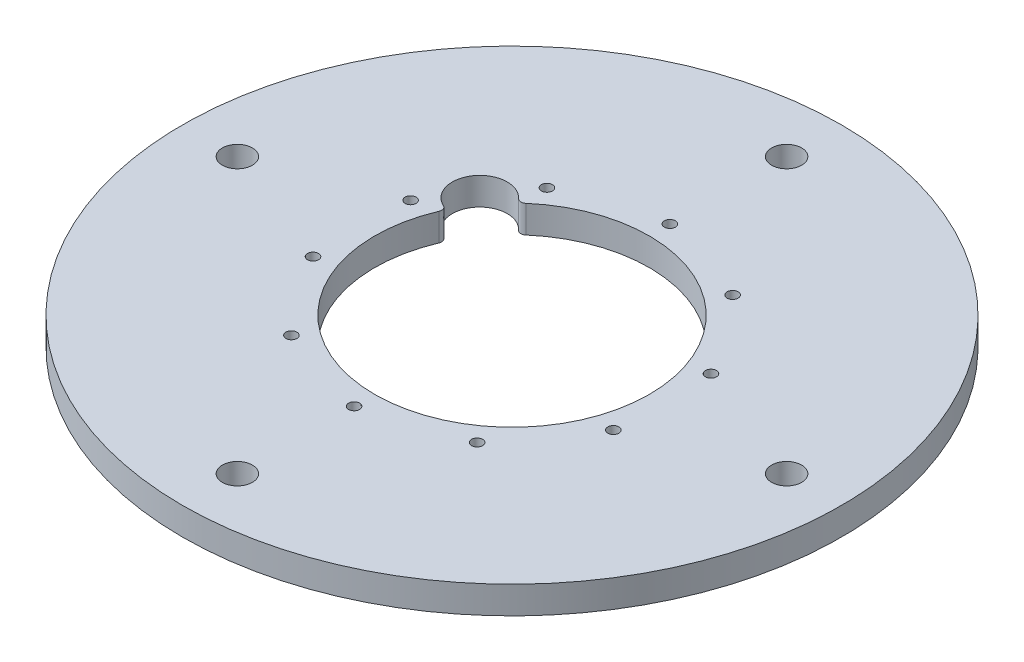
ISO-10303-21;
HEADER;
FILE_DESCRIPTION(('STEP AP214'),'2;1');
FILE_NAME('part.step','',(''),(''),'','','');
FILE_SCHEMA(('AUTOMOTIVE_DESIGN { 1 0 10303 214 1 1 1 1 }'));
ENDSEC;
DATA;
#1=APPLICATION_CONTEXT('core data for automotive mechanical design processes');
#2=APPLICATION_PROTOCOL_DEFINITION('international standard','automotive_design',2000,#1);
#3=PRODUCT_CONTEXT('',#1,'mechanical');
#4=PRODUCT('Part','Part','',(#3));
#5=PRODUCT_RELATED_PRODUCT_CATEGORY('part','',(#4));
#6=PRODUCT_DEFINITION_FORMATION('','',#4);
#7=PRODUCT_DEFINITION_CONTEXT('part definition',#1,'design');
#8=PRODUCT_DEFINITION('design','',#6,#7);
#9=PRODUCT_DEFINITION_SHAPE('','',#8);
#10=(LENGTH_UNIT() NAMED_UNIT(*) SI_UNIT(.MILLI.,.METRE.));
#11=(NAMED_UNIT(*) PLANE_ANGLE_UNIT() SI_UNIT($,.RADIAN.));
#12=(NAMED_UNIT(*) SI_UNIT($,.STERADIAN.) SOLID_ANGLE_UNIT());
#13=UNCERTAINTY_MEASURE_WITH_UNIT(LENGTH_MEASURE(1.E-05),#10,'distance_accuracy_value','');
#14=(GEOMETRIC_REPRESENTATION_CONTEXT(3) GLOBAL_UNCERTAINTY_ASSIGNED_CONTEXT((#13)) GLOBAL_UNIT_ASSIGNED_CONTEXT((#10,
#11,#12)) REPRESENTATION_CONTEXT('',''));
#15=CARTESIAN_POINT('',(0.,0.,0.));
#16=DIRECTION('',(0.,0.,1.));
#17=DIRECTION('',(1.,0.,0.));
#18=AXIS2_PLACEMENT_3D('',#15,#16,#17);
#19=CARTESIAN_POINT('',(0.,-12.7,0.));
#20=DIRECTION('',(0.,1.,0.));
#21=DIRECTION('',(0.,0.,1.));
#22=AXIS2_PLACEMENT_3D('',#19,#20,#21);
#23=CYLINDRICAL_SURFACE('',#22,63.5);
#24=DIRECTION('',(0.,1.,0.));
#25=VECTOR('',#24,1.);
#26=CARTESIAN_POINT('',(-41.5931280540035,-12.701,-47.9818892779689));
#27=LINE('',#26,#25);
#28=CARTESIAN_POINT('',(-41.5931280540035,-12.7,-47.9818892779689));
#29=VERTEX_POINT('',#28);
#30=CARTESIAN_POINT('',(-41.5931280540035,0.,-47.9818892779689));
#31=VERTEX_POINT('',#30);
#32=EDGE_CURVE('E97',#29,#31,#27,.T.);
#33=ORIENTED_EDGE('',*,*,#32,.F.);
#34=CARTESIAN_POINT('',(0.,-12.7,0.));
#35=DIRECTION('',(0.,1.,0.));
#36=DIRECTION('',(0.,0.,1.));
#37=AXIS2_PLACEMENT_3D('',#34,#35,#36);
#38=CIRCLE('',#37,63.5);
#39=CARTESIAN_POINT('',(-58.4864718798655,-12.7,-24.730196259749));
#40=VERTEX_POINT('',#39);
#41=EDGE_CURVE('E51',#40,#29,#38,.T.);
#42=ORIENTED_EDGE('',*,*,#41,.F.);
#43=DIRECTION('',(0.,1.,0.));
#44=VECTOR('',#43,1.);
#45=CARTESIAN_POINT('',(-58.4864718798655,-12.701,-24.730196259749));
#46=LINE('',#45,#44);
#47=CARTESIAN_POINT('',(-58.4864718798655,0.,-24.730196259749));
#48=VERTEX_POINT('',#47);
#49=EDGE_CURVE('E112',#40,#48,#46,.T.);
#50=ORIENTED_EDGE('',*,*,#49,.T.);
#51=CARTESIAN_POINT('',(0.,0.,0.));
#52=DIRECTION('',(0.,1.,0.));
#53=DIRECTION('',(0.,0.,1.));
#54=AXIS2_PLACEMENT_3D('',#51,#52,#53);
#55=CIRCLE('',#54,63.5);
#56=EDGE_CURVE('E199',#48,#31,#55,.T.);
#57=ORIENTED_EDGE('',*,*,#56,.T.);
#58=EDGE_LOOP('',(#33,#42,#50,#57));
#59=FACE_BOUND('',#58,.T.);
#60=ADVANCED_FACE('F43',(#59),#23,.F.);
#61=CARTESIAN_POINT('',(0.,-12.7,0.));
#62=DIRECTION('',(0.,1.,0.));
#63=DIRECTION('',(0.,0.,1.));
#64=AXIS2_PLACEMENT_3D('',#61,#62,#63);
#65=CYLINDRICAL_SURFACE('',#64,152.4);
#66=CARTESIAN_POINT('',(0.,-12.7,0.));
#67=DIRECTION('',(0.,1.,0.));
#68=DIRECTION('',(0.,0.,1.));
#69=AXIS2_PLACEMENT_3D('',#66,#67,#68);
#70=CIRCLE('',#69,152.4);
#71=CARTESIAN_POINT('',(0.,-12.7,152.4));
#72=VERTEX_POINT('',#71);
#73=EDGE_CURVE('E11',#72,#72,#70,.T.);
#74=ORIENTED_EDGE('',*,*,#73,.T.);
#75=EDGE_LOOP('',(#74));
#76=FACE_BOUND('',#75,.T.);
#77=CARTESIAN_POINT('',(0.,0.,0.));
#78=DIRECTION('',(0.,1.,0.));
#79=DIRECTION('',(0.,0.,1.));
#80=AXIS2_PLACEMENT_3D('',#77,#78,#79);
#81=CIRCLE('',#80,152.4);
#82=CARTESIAN_POINT('',(0.,0.,152.4));
#83=VERTEX_POINT('',#82);
#84=EDGE_CURVE('E46',#83,#83,#81,.T.);
#85=ORIENTED_EDGE('',*,*,#84,.F.);
#86=EDGE_LOOP('',(#85));
#87=FACE_BOUND('',#86,.T.);
#88=ADVANCED_FACE('F208',(#76,#87),#65,.T.);
#89=CARTESIAN_POINT('',(0.,-12.7,0.));
#90=DIRECTION('',(0.,1.,0.));
#91=DIRECTION('',(0.,0.,1.));
#92=AXIS2_PLACEMENT_3D('',#89,#90,#91);
#93=PLANE('',#92);
#94=ORIENTED_EDGE('',*,*,#41,.T.);
#95=CARTESIAN_POINT('',(-43.2568531761636,-12.7,-49.9011648490877));
#96=DIRECTION('',(0.,1.,0.));
#97=DIRECTION('',(0.,0.,1.));
#98=AXIS2_PLACEMENT_3D('',#95,#96,#97);
#99=CIRCLE('',#98,2.54000000000001);
#100=CARTESIAN_POINT('',(-45.1231999620326,-12.7,-48.1782749295408));
#101=VERTEX_POINT('',#100);
#102=EDGE_CURVE('E64',#101,#29,#99,.T.);
#103=ORIENTED_EDGE('',*,*,#102,.F.);
#104=CARTESIAN_POINT('',(-54.4549338913778,-12.7,-39.5638253318063));
#105=DIRECTION('',(0.,1.,0.));
#106=DIRECTION('',(0.,0.,1.));
#107=AXIS2_PLACEMENT_3D('',#104,#105,#106);
#108=CIRCLE('',#107,12.7);
#109=CARTESIAN_POINT('',(-59.7640979444464,-12.7,-28.0268076470836));
#110=VERTEX_POINT('',#109);
#111=EDGE_CURVE('E91',#110,#101,#108,.F.);
#112=ORIENTED_EDGE('',*,*,#111,.F.);
#113=CARTESIAN_POINT('',(-60.8259307550601,-12.7,-25.719404110139));
#114=DIRECTION('',(0.,1.,0.));
#115=DIRECTION('',(0.,0.,1.));
#116=AXIS2_PLACEMENT_3D('',#113,#114,#115);
#117=CIRCLE('',#116,2.53999999999999);
#118=EDGE_CURVE('E103',#40,#110,#117,.T.);
#119=ORIENTED_EDGE('',*,*,#118,.F.);
#120=EDGE_LOOP('',(#94,#103,#112,#119));
#121=FACE_BOUND('',#120,.T.);
#122=CARTESIAN_POINT('',(-42.9230180486571,-12.7,-59.0784660142311));
#123=DIRECTION('',(0.,1.,0.));
#124=DIRECTION('',(0.587785252292462,0.,0.809016994374955));
#125=AXIS2_PLACEMENT_3D('',#122,#123,#124);
#126=CIRCLE('',#125,2.5527);
#127=CARTESIAN_POINT('',(-41.4225786351301,-12.7,-57.0132883326902));
#128=VERTEX_POINT('',#127);
#129=EDGE_CURVE('E96',#128,#128,#126,.T.);
#130=ORIENTED_EDGE('',*,*,#129,.T.);
#131=EDGE_LOOP('',(#130));
#132=FACE_BOUND('',#131,.T.);
#133=CARTESIAN_POINT('',(-69.4509021024533,-12.7,-22.5659660142313));
#134=DIRECTION('',(0.,1.,0.));
#135=DIRECTION('',(0.95105651629515,0.,0.309016994374958));
#136=AXIS2_PLACEMENT_3D('',#133,#134,#135);
#137=CIRCLE('',#136,2.5527);
#138=CARTESIAN_POINT('',(-67.0231401333067,-12.7,-21.7771383326904));
#139=VERTEX_POINT('',#138);
#140=EDGE_CURVE('E154',#139,#139,#137,.T.);
#141=ORIENTED_EDGE('',*,*,#140,.T.);
#142=EDGE_LOOP('',(#141));
#143=FACE_BOUND('',#142,.T.);
#144=CARTESIAN_POINT('',(-69.4509021024538,-12.7,22.5659660142299));
#145=DIRECTION('',(0.,1.,0.));
#146=DIRECTION('',(0.951056516295157,0.,-0.309016994374938));
#147=AXIS2_PLACEMENT_3D('',#144,#145,#146);
#148=CIRCLE('',#147,2.5527);
#149=CARTESIAN_POINT('',(-67.0231401333072,-12.7,21.777138332689));
#150=VERTEX_POINT('',#149);
#151=EDGE_CURVE('E148',#150,#150,#148,.T.);
#152=ORIENTED_EDGE('',*,*,#151,.T.);
#153=EDGE_LOOP('',(#152));
#154=FACE_BOUND('',#153,.T.);
#155=CARTESIAN_POINT('',(-42.9230180486584,-12.7,59.0784660142301));
#156=DIRECTION('',(0.,1.,0.));
#157=DIRECTION('',(0.58778525229248,0.,-0.809016994374942));
#158=AXIS2_PLACEMENT_3D('',#155,#156,#157);
#159=CIRCLE('',#158,2.5527);
#160=CARTESIAN_POINT('',(-41.4225786351314,-12.7,57.0132883326892));
#161=VERTEX_POINT('',#160);
#162=EDGE_CURVE('E142',#161,#161,#159,.T.);
#163=ORIENTED_EDGE('',*,*,#162,.T.);
#164=EDGE_LOOP('',(#163));
#165=FACE_BOUND('',#164,.T.);
#166=CARTESIAN_POINT('',(0.,-12.7,73.025));
#167=DIRECTION('',(0.,1.,0.));
#168=DIRECTION('',(0.,0.,-1.));
#169=AXIS2_PLACEMENT_3D('',#166,#167,#168);
#170=CIRCLE('',#169,2.5527);
#171=CARTESIAN_POINT('',(0.,-12.7,70.4723));
#172=VERTEX_POINT('',#171);
#173=EDGE_CURVE('E136',#172,#172,#170,.T.);
#174=ORIENTED_EDGE('',*,*,#173,.T.);
#175=EDGE_LOOP('',(#174));
#176=FACE_BOUND('',#175,.T.);
#177=CARTESIAN_POINT('',(42.9230180486575,-12.7,59.0784660142308));
#178=DIRECTION('',(0.,1.,0.));
#179=DIRECTION('',(-0.587785252292469,0.,-0.809016994374951));
#180=AXIS2_PLACEMENT_3D('',#177,#178,#179);
#181=CIRCLE('',#180,2.5527);
#182=CARTESIAN_POINT('',(41.4225786351305,-12.7,57.0132883326898));
#183=VERTEX_POINT('',#182);
#184=EDGE_CURVE('E130',#183,#183,#181,.T.);
#185=ORIENTED_EDGE('',*,*,#184,.T.);
#186=EDGE_LOOP('',(#185));
#187=FACE_BOUND('',#186,.T.);
#188=CARTESIAN_POINT('',(69.4509021024535,-12.7,22.5659660142308));
#189=DIRECTION('',(0.,1.,0.));
#190=DIRECTION('',(-0.951056516295152,0.,-0.309016994374952));
#191=AXIS2_PLACEMENT_3D('',#188,#189,#190);
#192=CIRCLE('',#191,2.5527);
#193=CARTESIAN_POINT('',(67.0231401333069,-12.7,21.7771383326899));
#194=VERTEX_POINT('',#193);
#195=EDGE_CURVE('E124',#194,#194,#192,.T.);
#196=ORIENTED_EDGE('',*,*,#195,.T.);
#197=EDGE_LOOP('',(#196));
#198=FACE_BOUND('',#197,.T.);
#199=CARTESIAN_POINT('',(69.4509021024537,-12.7,-22.5659660142303));
#200=DIRECTION('',(0.,1.,0.));
#201=DIRECTION('',(-0.951056516295155,0.,0.309016994374945));
#202=AXIS2_PLACEMENT_3D('',#199,#200,#201);
#203=CIRCLE('',#202,2.5527);
#204=CARTESIAN_POINT('',(67.023140133307,-12.7,-21.7771383326894));
#205=VERTEX_POINT('',#204);
#206=EDGE_CURVE('E116',#205,#205,#203,.T.);
#207=ORIENTED_EDGE('',*,*,#206,.T.);
#208=EDGE_LOOP('',(#207));
#209=FACE_BOUND('',#208,.T.);
#210=CARTESIAN_POINT('',(42.9230180486579,-12.7,-59.0784660142305));
#211=DIRECTION('',(0.,1.,0.));
#212=DIRECTION('',(-0.587785252292474,0.,0.809016994374947));
#213=AXIS2_PLACEMENT_3D('',#210,#211,#212);
#214=CIRCLE('',#213,2.5527);
#215=CARTESIAN_POINT('',(41.4225786351309,-12.7,-57.0132883326896));
#216=VERTEX_POINT('',#215);
#217=EDGE_CURVE('E123',#216,#216,#214,.T.);
#218=ORIENTED_EDGE('',*,*,#217,.T.);
#219=EDGE_LOOP('',(#218));
#220=FACE_BOUND('',#219,.T.);
#221=CARTESIAN_POINT('',(0.,-12.7,-73.025));
#222=DIRECTION('',(0.,1.,0.));
#223=DIRECTION('',(0.,0.,1.));
#224=AXIS2_PLACEMENT_3D('',#221,#222,#223);
#225=CIRCLE('',#224,2.5527);
#226=CARTESIAN_POINT('',(0.,-12.7,-70.4723));
#227=VERTEX_POINT('',#226);
#228=EDGE_CURVE('E172',#227,#227,#225,.T.);
#229=ORIENTED_EDGE('',*,*,#228,.T.);
#230=EDGE_LOOP('',(#229));
#231=FACE_BOUND('',#230,.T.);
#232=CARTESIAN_POINT('',(127.,-12.7,4.43418130033078E-13));
#233=DIRECTION('',(0.,1.,0.));
#234=DIRECTION('',(-1.,0.,0.));
#235=AXIS2_PLACEMENT_3D('',#232,#233,#234);
#236=CIRCLE('',#235,6.94563);
#237=CARTESIAN_POINT('',(120.05437,-12.7,4.19167592501569E-13));
#238=VERTEX_POINT('',#237);
#239=EDGE_CURVE('E176',#238,#238,#236,.T.);
#240=ORIENTED_EDGE('',*,*,#239,.T.);
#241=EDGE_LOOP('',(#240));
#242=FACE_BOUND('',#241,.T.);
#243=CARTESIAN_POINT('',(0.,-12.7,127.));
#244=DIRECTION('',(0.,1.,0.));
#245=DIRECTION('',(0.,0.,-1.));
#246=AXIS2_PLACEMENT_3D('',#243,#244,#245);
#247=CIRCLE('',#246,6.94563);
#248=CARTESIAN_POINT('',(0.,-12.7,120.05437));
#249=VERTEX_POINT('',#248);
#250=EDGE_CURVE('E184',#249,#249,#247,.T.);
#251=ORIENTED_EDGE('',*,*,#250,.T.);
#252=EDGE_LOOP('',(#251));
#253=FACE_BOUND('',#252,.T.);
#254=CARTESIAN_POINT('',(-127.,-12.7,-1.33025439009923E-12));
#255=DIRECTION('',(0.,1.,0.));
#256=DIRECTION('',(1.,0.,0.));
#257=AXIS2_PLACEMENT_3D('',#254,#255,#256);
#258=CIRCLE('',#257,6.94563);
#259=CARTESIAN_POINT('',(-120.05437,-12.7,-1.25750277750471E-12));
#260=VERTEX_POINT('',#259);
#261=EDGE_CURVE('E175',#260,#260,#258,.T.);
#262=ORIENTED_EDGE('',*,*,#261,.T.);
#263=EDGE_LOOP('',(#262));
#264=FACE_BOUND('',#263,.T.);
#265=CARTESIAN_POINT('',(0.,-12.7,-127.));
#266=DIRECTION('',(0.,1.,0.));
#267=DIRECTION('',(0.,0.,1.));
#268=AXIS2_PLACEMENT_3D('',#265,#266,#267);
#269=CIRCLE('',#268,6.94563);
#270=CARTESIAN_POINT('',(0.,-12.7,-120.05437));
#271=VERTEX_POINT('',#270);
#272=EDGE_CURVE('E196',#271,#271,#269,.T.);
#273=ORIENTED_EDGE('',*,*,#272,.T.);
#274=EDGE_LOOP('',(#273));
#275=FACE_BOUND('',#274,.T.);
#276=ORIENTED_EDGE('',*,*,#73,.F.);
#277=EDGE_LOOP('',(#276));
#278=FACE_BOUND('',#277,.T.);
#279=ADVANCED_FACE('F100',(#121,#132,#143,#154,#165,#176,#187,#198,#209,#220,#231,#242,#253,
#264,#275,#278),#93,.F.);
#280=CARTESIAN_POINT('',(0.,0.,0.));
#281=DIRECTION('',(0.,1.,0.));
#282=DIRECTION('',(0.,0.,1.));
#283=AXIS2_PLACEMENT_3D('',#280,#281,#282);
#284=PLANE('',#283);
#285=CARTESIAN_POINT('',(-43.2568531761636,0.,-49.9011648490877));
#286=DIRECTION('',(0.,-1.,0.));
#287=DIRECTION('',(0.,0.,1.));
#288=AXIS2_PLACEMENT_3D('',#285,#286,#287);
#289=CIRCLE('',#288,2.54000000000001);
#290=CARTESIAN_POINT('',(-45.1231999620326,0.,-48.1782749295408));
#291=VERTEX_POINT('',#290);
#292=EDGE_CURVE('E59',#31,#291,#289,.T.);
#293=ORIENTED_EDGE('',*,*,#292,.F.);
#294=ORIENTED_EDGE('',*,*,#56,.F.);
#295=CARTESIAN_POINT('',(-60.8259307550601,0.,-25.719404110139));
#296=DIRECTION('',(0.,-1.,0.));
#297=DIRECTION('',(0.,0.,-1.));
#298=AXIS2_PLACEMENT_3D('',#295,#296,#297);
#299=CIRCLE('',#298,2.53999999999999);
#300=CARTESIAN_POINT('',(-59.7640979444464,0.,-28.0268076470836));
#301=VERTEX_POINT('',#300);
#302=EDGE_CURVE('E88',#301,#48,#299,.T.);
#303=ORIENTED_EDGE('',*,*,#302,.F.);
#304=CARTESIAN_POINT('',(-54.4549338913778,0.,-39.5638253318063));
#305=DIRECTION('',(0.,1.,0.));
#306=DIRECTION('',(0.,0.,1.));
#307=AXIS2_PLACEMENT_3D('',#304,#305,#306);
#308=CIRCLE('',#307,12.7);
#309=EDGE_CURVE('E105',#291,#301,#308,.T.);
#310=ORIENTED_EDGE('',*,*,#309,.F.);
#311=EDGE_LOOP('',(#293,#294,#303,#310));
#312=FACE_BOUND('',#311,.T.);
#313=CARTESIAN_POINT('',(-42.9230180486571,0.,-59.0784660142311));
#314=DIRECTION('',(0.,1.,0.));
#315=DIRECTION('',(0.587785252292462,0.,0.809016994374955));
#316=AXIS2_PLACEMENT_3D('',#313,#314,#315);
#317=CIRCLE('',#316,2.5527);
#318=CARTESIAN_POINT('',(-41.4225786351301,0.,-57.0132883326901));
#319=VERTEX_POINT('',#318);
#320=EDGE_CURVE('E157',#319,#319,#317,.T.);
#321=ORIENTED_EDGE('',*,*,#320,.F.);
#322=EDGE_LOOP('',(#321));
#323=FACE_BOUND('',#322,.T.);
#324=CARTESIAN_POINT('',(-69.4509021024533,0.,-22.5659660142313));
#325=DIRECTION('',(0.,1.,0.));
#326=DIRECTION('',(0.95105651629515,0.,0.309016994374958));
#327=AXIS2_PLACEMENT_3D('',#324,#325,#326);
#328=CIRCLE('',#327,2.5527);
#329=CARTESIAN_POINT('',(-67.0231401333067,0.,-21.7771383326904));
#330=VERTEX_POINT('',#329);
#331=EDGE_CURVE('E151',#330,#330,#328,.T.);
#332=ORIENTED_EDGE('',*,*,#331,.F.);
#333=EDGE_LOOP('',(#332));
#334=FACE_BOUND('',#333,.T.);
#335=CARTESIAN_POINT('',(-69.4509021024538,0.,22.5659660142299));
#336=DIRECTION('',(0.,1.,0.));
#337=DIRECTION('',(0.951056516295157,0.,-0.309016994374938));
#338=AXIS2_PLACEMENT_3D('',#335,#336,#337);
#339=CIRCLE('',#338,2.5527);
#340=CARTESIAN_POINT('',(-67.0231401333072,0.,21.777138332689));
#341=VERTEX_POINT('',#340);
#342=EDGE_CURVE('E145',#341,#341,#339,.T.);
#343=ORIENTED_EDGE('',*,*,#342,.F.);
#344=EDGE_LOOP('',(#343));
#345=FACE_BOUND('',#344,.T.);
#346=CARTESIAN_POINT('',(-42.9230180486584,0.,59.0784660142301));
#347=DIRECTION('',(0.,1.,0.));
#348=DIRECTION('',(0.58778525229248,0.,-0.809016994374942));
#349=AXIS2_PLACEMENT_3D('',#346,#347,#348);
#350=CIRCLE('',#349,2.5527);
#351=CARTESIAN_POINT('',(-41.4225786351314,0.,57.0132883326892));
#352=VERTEX_POINT('',#351);
#353=EDGE_CURVE('E139',#352,#352,#350,.T.);
#354=ORIENTED_EDGE('',*,*,#353,.F.);
#355=EDGE_LOOP('',(#354));
#356=FACE_BOUND('',#355,.T.);
#357=CARTESIAN_POINT('',(0.,0.,73.025));
#358=DIRECTION('',(0.,1.,0.));
#359=DIRECTION('',(0.,0.,-1.));
#360=AXIS2_PLACEMENT_3D('',#357,#358,#359);
#361=CIRCLE('',#360,2.5527);
#362=CARTESIAN_POINT('',(0.,0.,70.4723));
#363=VERTEX_POINT('',#362);
#364=EDGE_CURVE('E133',#363,#363,#361,.T.);
#365=ORIENTED_EDGE('',*,*,#364,.F.);
#366=EDGE_LOOP('',(#365));
#367=FACE_BOUND('',#366,.T.);
#368=CARTESIAN_POINT('',(42.9230180486575,0.,59.0784660142308));
#369=DIRECTION('',(0.,1.,0.));
#370=DIRECTION('',(-0.587785252292469,0.,-0.809016994374951));
#371=AXIS2_PLACEMENT_3D('',#368,#369,#370);
#372=CIRCLE('',#371,2.5527);
#373=CARTESIAN_POINT('',(41.4225786351305,0.,57.0132883326898));
#374=VERTEX_POINT('',#373);
#375=EDGE_CURVE('E127',#374,#374,#372,.T.);
#376=ORIENTED_EDGE('',*,*,#375,.F.);
#377=EDGE_LOOP('',(#376));
#378=FACE_BOUND('',#377,.T.);
#379=CARTESIAN_POINT('',(69.4509021024535,0.,22.5659660142308));
#380=DIRECTION('',(0.,1.,0.));
#381=DIRECTION('',(-0.951056516295152,0.,-0.309016994374952));
#382=AXIS2_PLACEMENT_3D('',#379,#380,#381);
#383=CIRCLE('',#382,2.5527);
#384=CARTESIAN_POINT('',(67.0231401333069,0.,21.7771383326899));
#385=VERTEX_POINT('',#384);
#386=EDGE_CURVE('E120',#385,#385,#383,.T.);
#387=ORIENTED_EDGE('',*,*,#386,.F.);
#388=EDGE_LOOP('',(#387));
#389=FACE_BOUND('',#388,.T.);
#390=CARTESIAN_POINT('',(69.4509021024537,0.,-22.5659660142303));
#391=DIRECTION('',(0.,1.,0.));
#392=DIRECTION('',(-0.951056516295155,0.,0.309016994374945));
#393=AXIS2_PLACEMENT_3D('',#390,#391,#392);
#394=CIRCLE('',#393,2.5527);
#395=CARTESIAN_POINT('',(67.023140133307,0.,-21.7771383326894));
#396=VERTEX_POINT('',#395);
#397=EDGE_CURVE('E119',#396,#396,#394,.T.);
#398=ORIENTED_EDGE('',*,*,#397,.F.);
#399=EDGE_LOOP('',(#398));
#400=FACE_BOUND('',#399,.T.);
#401=CARTESIAN_POINT('',(42.9230180486579,0.,-59.0784660142305));
#402=DIRECTION('',(0.,1.,0.));
#403=DIRECTION('',(-0.587785252292474,0.,0.809016994374947));
#404=AXIS2_PLACEMENT_3D('',#401,#402,#403);
#405=CIRCLE('',#404,2.5527);
#406=CARTESIAN_POINT('',(41.4225786351309,0.,-57.0132883326896));
#407=VERTEX_POINT('',#406);
#408=EDGE_CURVE('E166',#407,#407,#405,.T.);
#409=ORIENTED_EDGE('',*,*,#408,.F.);
#410=EDGE_LOOP('',(#409));
#411=FACE_BOUND('',#410,.T.);
#412=CARTESIAN_POINT('',(0.,0.,-73.025));
#413=DIRECTION('',(0.,1.,0.));
#414=DIRECTION('',(0.,0.,1.));
#415=AXIS2_PLACEMENT_3D('',#412,#413,#414);
#416=CIRCLE('',#415,2.5527);
#417=CARTESIAN_POINT('',(0.,0.,-70.4723));
#418=VERTEX_POINT('',#417);
#419=EDGE_CURVE('E169',#418,#418,#416,.T.);
#420=ORIENTED_EDGE('',*,*,#419,.F.);
#421=EDGE_LOOP('',(#420));
#422=FACE_BOUND('',#421,.T.);
#423=CARTESIAN_POINT('',(127.,0.,4.43418130033078E-13));
#424=DIRECTION('',(0.,1.,0.));
#425=DIRECTION('',(-1.,0.,0.));
#426=AXIS2_PLACEMENT_3D('',#423,#424,#425);
#427=CIRCLE('',#426,6.94563);
#428=CARTESIAN_POINT('',(120.05437,0.,4.19167592501569E-13));
#429=VERTEX_POINT('',#428);
#430=EDGE_CURVE('E179',#429,#429,#427,.T.);
#431=ORIENTED_EDGE('',*,*,#430,.F.);
#432=EDGE_LOOP('',(#431));
#433=FACE_BOUND('',#432,.T.);
#434=CARTESIAN_POINT('',(0.,0.,127.));
#435=DIRECTION('',(0.,1.,0.));
#436=DIRECTION('',(0.,0.,-1.));
#437=AXIS2_PLACEMENT_3D('',#434,#435,#436);
#438=CIRCLE('',#437,6.94563);
#439=CARTESIAN_POINT('',(0.,0.,120.05437));
#440=VERTEX_POINT('',#439);
#441=EDGE_CURVE('E180',#440,#440,#438,.T.);
#442=ORIENTED_EDGE('',*,*,#441,.F.);
#443=EDGE_LOOP('',(#442));
#444=FACE_BOUND('',#443,.T.);
#445=CARTESIAN_POINT('',(-127.,0.,-1.33025439009923E-12));
#446=DIRECTION('',(0.,1.,0.));
#447=DIRECTION('',(1.,0.,0.));
#448=AXIS2_PLACEMENT_3D('',#445,#446,#447);
#449=CIRCLE('',#448,6.94563);
#450=CARTESIAN_POINT('',(-120.05437,0.,-1.25750277750471E-12));
#451=VERTEX_POINT('',#450);
#452=EDGE_CURVE('E187',#451,#451,#449,.T.);
#453=ORIENTED_EDGE('',*,*,#452,.F.);
#454=EDGE_LOOP('',(#453));
#455=FACE_BOUND('',#454,.T.);
#456=CARTESIAN_POINT('',(0.,0.,-127.));
#457=DIRECTION('',(0.,1.,0.));
#458=DIRECTION('',(0.,0.,1.));
#459=AXIS2_PLACEMENT_3D('',#456,#457,#458);
#460=CIRCLE('',#459,6.94563);
#461=CARTESIAN_POINT('',(0.,0.,-120.05437));
#462=VERTEX_POINT('',#461);
#463=EDGE_CURVE('E183',#462,#462,#460,.T.);
#464=ORIENTED_EDGE('',*,*,#463,.F.);
#465=EDGE_LOOP('',(#464));
#466=FACE_BOUND('',#465,.T.);
#467=ORIENTED_EDGE('',*,*,#84,.T.);
#468=EDGE_LOOP('',(#467));
#469=FACE_BOUND('',#468,.T.);
#470=ADVANCED_FACE('F206',(#312,#323,#334,#345,#356,#367,#378,#389,#400,#411,#422,#433,#444,
#455,#466,#469),#284,.T.);
#471=CARTESIAN_POINT('',(0.,0.,-127.));
#472=DIRECTION('',(0.,1.,0.));
#473=DIRECTION('',(0.,0.,1.));
#474=AXIS2_PLACEMENT_3D('',#471,#472,#473);
#475=CYLINDRICAL_SURFACE('',#474,6.94563);
#476=ORIENTED_EDGE('',*,*,#272,.F.);
#477=EDGE_LOOP('',(#476));
#478=FACE_BOUND('',#477,.T.);
#479=ORIENTED_EDGE('',*,*,#463,.T.);
#480=EDGE_LOOP('',(#479));
#481=FACE_BOUND('',#480,.T.);
#482=ADVANCED_FACE('F219',(#478,#481),#475,.F.);
#483=CARTESIAN_POINT('',(-127.,0.,-1.33025439009923E-12));
#484=DIRECTION('',(0.,1.,0.));
#485=DIRECTION('',(1.,0.,0.));
#486=AXIS2_PLACEMENT_3D('',#483,#484,#485);
#487=CYLINDRICAL_SURFACE('',#486,6.94563);
#488=ORIENTED_EDGE('',*,*,#261,.F.);
#489=EDGE_LOOP('',(#488));
#490=FACE_BOUND('',#489,.T.);
#491=ORIENTED_EDGE('',*,*,#452,.T.);
#492=EDGE_LOOP('',(#491));
#493=FACE_BOUND('',#492,.T.);
#494=ADVANCED_FACE('F223',(#490,#493),#487,.F.);
#495=CARTESIAN_POINT('',(0.,0.,127.));
#496=DIRECTION('',(0.,1.,0.));
#497=DIRECTION('',(0.,0.,-1.));
#498=AXIS2_PLACEMENT_3D('',#495,#496,#497);
#499=CYLINDRICAL_SURFACE('',#498,6.94563);
#500=ORIENTED_EDGE('',*,*,#250,.F.);
#501=EDGE_LOOP('',(#500));
#502=FACE_BOUND('',#501,.T.);
#503=ORIENTED_EDGE('',*,*,#441,.T.);
#504=EDGE_LOOP('',(#503));
#505=FACE_BOUND('',#504,.T.);
#506=ADVANCED_FACE('F227',(#502,#505),#499,.F.);
#507=CARTESIAN_POINT('',(127.,0.,4.43418130033078E-13));
#508=DIRECTION('',(0.,1.,0.));
#509=DIRECTION('',(-1.,0.,0.));
#510=AXIS2_PLACEMENT_3D('',#507,#508,#509);
#511=CYLINDRICAL_SURFACE('',#510,6.94563);
#512=ORIENTED_EDGE('',*,*,#239,.F.);
#513=EDGE_LOOP('',(#512));
#514=FACE_BOUND('',#513,.T.);
#515=ORIENTED_EDGE('',*,*,#430,.T.);
#516=EDGE_LOOP('',(#515));
#517=FACE_BOUND('',#516,.T.);
#518=ADVANCED_FACE('F231',(#514,#517),#511,.F.);
#519=CARTESIAN_POINT('',(0.,0.,-73.025));
#520=DIRECTION('',(0.,1.,0.));
#521=DIRECTION('',(0.,0.,1.));
#522=AXIS2_PLACEMENT_3D('',#519,#520,#521);
#523=CYLINDRICAL_SURFACE('',#522,2.5527);
#524=ORIENTED_EDGE('',*,*,#228,.F.);
#525=EDGE_LOOP('',(#524));
#526=FACE_BOUND('',#525,.T.);
#527=ORIENTED_EDGE('',*,*,#419,.T.);
#528=EDGE_LOOP('',(#527));
#529=FACE_BOUND('',#528,.T.);
#530=ADVANCED_FACE('F235',(#526,#529),#523,.F.);
#531=CARTESIAN_POINT('',(42.9230180486579,0.,-59.0784660142305));
#532=DIRECTION('',(0.,1.,0.));
#533=DIRECTION('',(-0.587785252292474,0.,0.809016994374947));
#534=AXIS2_PLACEMENT_3D('',#531,#532,#533);
#535=CYLINDRICAL_SURFACE('',#534,2.5527);
#536=ORIENTED_EDGE('',*,*,#217,.F.);
#537=EDGE_LOOP('',(#536));
#538=FACE_BOUND('',#537,.T.);
#539=ORIENTED_EDGE('',*,*,#408,.T.);
#540=EDGE_LOOP('',(#539));
#541=FACE_BOUND('',#540,.T.);
#542=ADVANCED_FACE('F239',(#538,#541),#535,.F.);
#543=CARTESIAN_POINT('',(69.4509021024537,0.,-22.5659660142303));
#544=DIRECTION('',(0.,1.,0.));
#545=DIRECTION('',(-0.951056516295155,0.,0.309016994374945));
#546=AXIS2_PLACEMENT_3D('',#543,#544,#545);
#547=CYLINDRICAL_SURFACE('',#546,2.5527);
#548=ORIENTED_EDGE('',*,*,#206,.F.);
#549=EDGE_LOOP('',(#548));
#550=FACE_BOUND('',#549,.T.);
#551=ORIENTED_EDGE('',*,*,#397,.T.);
#552=EDGE_LOOP('',(#551));
#553=FACE_BOUND('',#552,.T.);
#554=ADVANCED_FACE('F243',(#550,#553),#547,.F.);
#555=CARTESIAN_POINT('',(69.4509021024535,0.,22.5659660142308));
#556=DIRECTION('',(0.,1.,0.));
#557=DIRECTION('',(-0.951056516295152,0.,-0.309016994374952));
#558=AXIS2_PLACEMENT_3D('',#555,#556,#557);
#559=CYLINDRICAL_SURFACE('',#558,2.5527);
#560=ORIENTED_EDGE('',*,*,#195,.F.);
#561=EDGE_LOOP('',(#560));
#562=FACE_BOUND('',#561,.T.);
#563=ORIENTED_EDGE('',*,*,#386,.T.);
#564=EDGE_LOOP('',(#563));
#565=FACE_BOUND('',#564,.T.);
#566=ADVANCED_FACE('F268',(#562,#565),#559,.F.);
#567=CARTESIAN_POINT('',(42.9230180486575,0.,59.0784660142308));
#568=DIRECTION('',(0.,1.,0.));
#569=DIRECTION('',(-0.587785252292469,0.,-0.809016994374951));
#570=AXIS2_PLACEMENT_3D('',#567,#568,#569);
#571=CYLINDRICAL_SURFACE('',#570,2.5527);
#572=ORIENTED_EDGE('',*,*,#184,.F.);
#573=EDGE_LOOP('',(#572));
#574=FACE_BOUND('',#573,.T.);
#575=ORIENTED_EDGE('',*,*,#375,.T.);
#576=EDGE_LOOP('',(#575));
#577=FACE_BOUND('',#576,.T.);
#578=ADVANCED_FACE('F264',(#574,#577),#571,.F.);
#579=CARTESIAN_POINT('',(0.,0.,73.025));
#580=DIRECTION('',(0.,1.,0.));
#581=DIRECTION('',(0.,0.,-1.));
#582=AXIS2_PLACEMENT_3D('',#579,#580,#581);
#583=CYLINDRICAL_SURFACE('',#582,2.5527);
#584=ORIENTED_EDGE('',*,*,#173,.F.);
#585=EDGE_LOOP('',(#584));
#586=FACE_BOUND('',#585,.T.);
#587=ORIENTED_EDGE('',*,*,#364,.T.);
#588=EDGE_LOOP('',(#587));
#589=FACE_BOUND('',#588,.T.);
#590=ADVANCED_FACE('F260',(#586,#589),#583,.F.);
#591=CARTESIAN_POINT('',(-42.9230180486584,0.,59.0784660142301));
#592=DIRECTION('',(0.,1.,0.));
#593=DIRECTION('',(0.58778525229248,0.,-0.809016994374942));
#594=AXIS2_PLACEMENT_3D('',#591,#592,#593);
#595=CYLINDRICAL_SURFACE('',#594,2.5527);
#596=ORIENTED_EDGE('',*,*,#162,.F.);
#597=EDGE_LOOP('',(#596));
#598=FACE_BOUND('',#597,.T.);
#599=ORIENTED_EDGE('',*,*,#353,.T.);
#600=EDGE_LOOP('',(#599));
#601=FACE_BOUND('',#600,.T.);
#602=ADVANCED_FACE('F256',(#598,#601),#595,.F.);
#603=CARTESIAN_POINT('',(-69.4509021024538,0.,22.5659660142299));
#604=DIRECTION('',(0.,1.,0.));
#605=DIRECTION('',(0.951056516295157,0.,-0.309016994374938));
#606=AXIS2_PLACEMENT_3D('',#603,#604,#605);
#607=CYLINDRICAL_SURFACE('',#606,2.5527);
#608=ORIENTED_EDGE('',*,*,#151,.F.);
#609=EDGE_LOOP('',(#608));
#610=FACE_BOUND('',#609,.T.);
#611=ORIENTED_EDGE('',*,*,#342,.T.);
#612=EDGE_LOOP('',(#611));
#613=FACE_BOUND('',#612,.T.);
#614=ADVANCED_FACE('F252',(#610,#613),#607,.F.);
#615=CARTESIAN_POINT('',(-69.4509021024533,0.,-22.5659660142313));
#616=DIRECTION('',(0.,1.,0.));
#617=DIRECTION('',(0.95105651629515,0.,0.309016994374958));
#618=AXIS2_PLACEMENT_3D('',#615,#616,#617);
#619=CYLINDRICAL_SURFACE('',#618,2.5527);
#620=ORIENTED_EDGE('',*,*,#140,.F.);
#621=EDGE_LOOP('',(#620));
#622=FACE_BOUND('',#621,.T.);
#623=ORIENTED_EDGE('',*,*,#331,.T.);
#624=EDGE_LOOP('',(#623));
#625=FACE_BOUND('',#624,.T.);
#626=ADVANCED_FACE('F248',(#622,#625),#619,.F.);
#627=CARTESIAN_POINT('',(-42.9230180486571,0.,-59.0784660142311));
#628=DIRECTION('',(0.,1.,0.));
#629=DIRECTION('',(0.587785252292462,0.,0.809016994374955));
#630=AXIS2_PLACEMENT_3D('',#627,#628,#629);
#631=CYLINDRICAL_SURFACE('',#630,2.5527);
#632=ORIENTED_EDGE('',*,*,#129,.F.);
#633=EDGE_LOOP('',(#632));
#634=FACE_BOUND('',#633,.T.);
#635=ORIENTED_EDGE('',*,*,#320,.T.);
#636=EDGE_LOOP('',(#635));
#637=FACE_BOUND('',#636,.T.);
#638=ADVANCED_FACE('F245',(#634,#637),#631,.F.);
#639=CARTESIAN_POINT('',(-43.2568531761636,-12.701,-49.9011648490877));
#640=DIRECTION('',(0.,1.,0.));
#641=DIRECTION('',(0.,0.,1.));
#642=AXIS2_PLACEMENT_3D('',#639,#640,#641);
#643=CYLINDRICAL_SURFACE('',#642,2.54000000000001);
#644=ORIENTED_EDGE('',*,*,#102,.T.);
#645=ORIENTED_EDGE('',*,*,#32,.T.);
#646=ORIENTED_EDGE('',*,*,#292,.T.);
#647=DIRECTION('',(0.,1.,0.));
#648=VECTOR('',#647,1.);
#649=CARTESIAN_POINT('',(-45.1231999620326,-12.701,-48.1782749295408));
#650=LINE('',#649,#648);
#651=EDGE_CURVE('E81',#101,#291,#650,.T.);
#652=ORIENTED_EDGE('',*,*,#651,.F.);
#653=EDGE_LOOP('',(#644,#645,#646,#652));
#654=FACE_BOUND('',#653,.T.);
#655=ADVANCED_FACE('F83',(#654),#643,.T.);
#656=CARTESIAN_POINT('',(-60.8259307550601,-12.701,-25.719404110139));
#657=DIRECTION('',(0.,1.,0.));
#658=DIRECTION('',(0.,0.,1.));
#659=AXIS2_PLACEMENT_3D('',#656,#657,#658);
#660=CYLINDRICAL_SURFACE('',#659,2.53999999999999);
#661=ORIENTED_EDGE('',*,*,#118,.T.);
#662=DIRECTION('',(0.,1.,0.));
#663=VECTOR('',#662,1.);
#664=CARTESIAN_POINT('',(-59.7640979444464,-12.701,-28.0268076470836));
#665=LINE('',#664,#663);
#666=EDGE_CURVE('E87',#110,#301,#665,.T.);
#667=ORIENTED_EDGE('',*,*,#666,.T.);
#668=ORIENTED_EDGE('',*,*,#302,.T.);
#669=ORIENTED_EDGE('',*,*,#49,.F.);
#670=EDGE_LOOP('',(#661,#667,#668,#669));
#671=FACE_BOUND('',#670,.T.);
#672=ADVANCED_FACE('F278',(#671),#660,.T.);
#673=CARTESIAN_POINT('',(-54.4549338913778,-12.701,-39.5638253318063));
#674=DIRECTION('',(0.,1.,0.));
#675=DIRECTION('',(0.,0.,1.));
#676=AXIS2_PLACEMENT_3D('',#673,#674,#675);
#677=CYLINDRICAL_SURFACE('',#676,12.7);
#678=ORIENTED_EDGE('',*,*,#111,.T.);
#679=ORIENTED_EDGE('',*,*,#651,.T.);
#680=ORIENTED_EDGE('',*,*,#309,.T.);
#681=ORIENTED_EDGE('',*,*,#666,.F.);
#682=EDGE_LOOP('',(#678,#679,#680,#681));
#683=FACE_BOUND('',#682,.T.);
#684=ADVANCED_FACE('F92',(#683),#677,.F.);
#685=CLOSED_SHELL('',(#60,#88,#279,#470,#482,#494,#506,#518,#530,#542,#554,#566,#578,#590,#602,
#614,#626,#638,#655,#672,#684));
#686=MANIFOLD_SOLID_BREP('B2',#685);
#687=ADVANCED_BREP_SHAPE_REPRESENTATION('',(#18,#686),#14);
#688=SHAPE_DEFINITION_REPRESENTATION(#9,#687);
ENDSEC;
END-ISO-10303-21;
